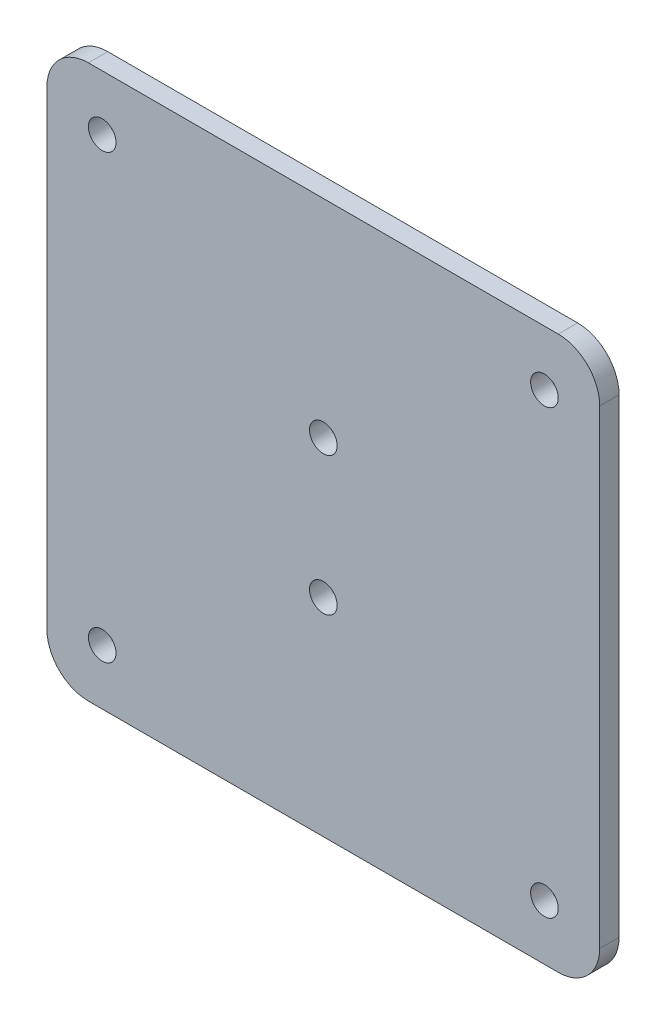
ISO-10303-21;
HEADER;
FILE_DESCRIPTION(('STEP AP214'),'2;1');
FILE_NAME('part.step','',(''),(''),'','','');
FILE_SCHEMA(('AUTOMOTIVE_DESIGN { 1 0 10303 214 1 1 1 1 }'));
ENDSEC;
DATA;
#1=APPLICATION_CONTEXT('core data for automotive mechanical design processes');
#2=APPLICATION_PROTOCOL_DEFINITION('international standard','automotive_design',2000,#1);
#3=PRODUCT_CONTEXT('',#1,'mechanical');
#4=PRODUCT('Part','Part','',(#3));
#5=PRODUCT_RELATED_PRODUCT_CATEGORY('part','',(#4));
#6=PRODUCT_DEFINITION_FORMATION('','',#4);
#7=PRODUCT_DEFINITION_CONTEXT('part definition',#1,'design');
#8=PRODUCT_DEFINITION('design','',#6,#7);
#9=PRODUCT_DEFINITION_SHAPE('','',#8);
#10=(LENGTH_UNIT() NAMED_UNIT(*) SI_UNIT(.MILLI.,.METRE.));
#11=(NAMED_UNIT(*) PLANE_ANGLE_UNIT() SI_UNIT($,.RADIAN.));
#12=(NAMED_UNIT(*) SI_UNIT($,.STERADIAN.) SOLID_ANGLE_UNIT());
#13=UNCERTAINTY_MEASURE_WITH_UNIT(LENGTH_MEASURE(1.E-05),#10,'distance_accuracy_value','');
#14=(GEOMETRIC_REPRESENTATION_CONTEXT(3) GLOBAL_UNCERTAINTY_ASSIGNED_CONTEXT((#13)) GLOBAL_UNIT_ASSIGNED_CONTEXT((#10,
#11,#12)) REPRESENTATION_CONTEXT('',''));
#15=CARTESIAN_POINT('',(0.,0.,0.));
#16=DIRECTION('',(0.,0.,1.));
#17=DIRECTION('',(1.,0.,0.));
#18=AXIS2_PLACEMENT_3D('',#15,#16,#17);
#19=CARTESIAN_POINT('',(0.,0.,7.));
#20=DIRECTION('',(0.,0.,-1.));
#21=DIRECTION('',(-1.,0.,0.));
#22=AXIS2_PLACEMENT_3D('',#19,#20,#21);
#23=PLANE('',#22);
#24=CARTESIAN_POINT('',(0.,-25.,7.));
#25=DIRECTION('',(0.,0.,-1.));
#26=DIRECTION('',(-1.,0.,0.));
#27=AXIS2_PLACEMENT_3D('',#24,#25,#26);
#28=CIRCLE('',#27,5.);
#29=CARTESIAN_POINT('',(-5.,-25.,7.));
#30=VERTEX_POINT('',#29);
#31=EDGE_CURVE('E235',#30,#30,#28,.T.);
#32=ORIENTED_EDGE('',*,*,#31,.T.);
#33=EDGE_LOOP('',(#32));
#34=FACE_BOUND('',#33,.T.);
#35=CARTESIAN_POINT('',(0.,25.,7.));
#36=DIRECTION('',(0.,0.,-1.));
#37=DIRECTION('',(-1.,0.,0.));
#38=AXIS2_PLACEMENT_3D('',#35,#36,#37);
#39=CIRCLE('',#38,5.);
#40=CARTESIAN_POINT('',(-5.,25.,7.));
#41=VERTEX_POINT('',#40);
#42=EDGE_CURVE('E242',#41,#41,#39,.T.);
#43=ORIENTED_EDGE('',*,*,#42,.T.);
#44=EDGE_LOOP('',(#43));
#45=FACE_BOUND('',#44,.T.);
#46=DIRECTION('',(0.,-1.,0.));
#47=VECTOR('',#46,1.);
#48=CARTESIAN_POINT('',(-100.,-100.,7.));
#49=LINE('',#48,#47);
#50=CARTESIAN_POINT('',(-100.,85.,7.));
#51=VERTEX_POINT('',#50);
#52=CARTESIAN_POINT('',(-100.,-85.,7.));
#53=VERTEX_POINT('',#52);
#54=EDGE_CURVE('E150',#51,#53,#49,.T.);
#55=ORIENTED_EDGE('',*,*,#54,.T.);
#56=CARTESIAN_POINT('',(-85.,-85.,7.));
#57=DIRECTION('',(0.,0.,-1.));
#58=DIRECTION('',(-1.,0.,0.));
#59=AXIS2_PLACEMENT_3D('',#56,#57,#58);
#60=CIRCLE('',#59,15.);
#61=CARTESIAN_POINT('',(-85.,-100.,7.));
#62=VERTEX_POINT('',#61);
#63=EDGE_CURVE('E174',#53,#62,#60,.F.);
#64=ORIENTED_EDGE('',*,*,#63,.T.);
#65=DIRECTION('',(1.,0.,0.));
#66=VECTOR('',#65,1.);
#67=CARTESIAN_POINT('',(-100.,-100.,7.));
#68=LINE('',#67,#66);
#69=CARTESIAN_POINT('',(85.,-100.,7.));
#70=VERTEX_POINT('',#69);
#71=EDGE_CURVE('E127',#62,#70,#68,.T.);
#72=ORIENTED_EDGE('',*,*,#71,.T.);
#73=CARTESIAN_POINT('',(85.,-85.,7.));
#74=DIRECTION('',(0.,0.,-1.));
#75=DIRECTION('',(-1.,0.,0.));
#76=AXIS2_PLACEMENT_3D('',#73,#74,#75);
#77=CIRCLE('',#76,15.);
#78=CARTESIAN_POINT('',(100.,-85.,7.));
#79=VERTEX_POINT('',#78);
#80=EDGE_CURVE('E166',#70,#79,#77,.F.);
#81=ORIENTED_EDGE('',*,*,#80,.T.);
#82=DIRECTION('',(0.,1.,0.));
#83=VECTOR('',#82,1.);
#84=CARTESIAN_POINT('',(100.,-100.,7.));
#85=LINE('',#84,#83);
#86=CARTESIAN_POINT('',(100.,85.,7.));
#87=VERTEX_POINT('',#86);
#88=EDGE_CURVE('E189',#79,#87,#85,.T.);
#89=ORIENTED_EDGE('',*,*,#88,.T.);
#90=CARTESIAN_POINT('',(85.,85.,7.));
#91=DIRECTION('',(0.,0.,-1.));
#92=DIRECTION('',(-1.,0.,0.));
#93=AXIS2_PLACEMENT_3D('',#90,#91,#92);
#94=CIRCLE('',#93,15.);
#95=CARTESIAN_POINT('',(85.,100.,7.));
#96=VERTEX_POINT('',#95);
#97=EDGE_CURVE('E62',#87,#96,#94,.F.);
#98=ORIENTED_EDGE('',*,*,#97,.T.);
#99=DIRECTION('',(-1.,0.,0.));
#100=VECTOR('',#99,1.);
#101=CARTESIAN_POINT('',(-100.,100.,7.));
#102=LINE('',#101,#100);
#103=CARTESIAN_POINT('',(-85.,100.,7.));
#104=VERTEX_POINT('',#103);
#105=EDGE_CURVE('E152',#96,#104,#102,.T.);
#106=ORIENTED_EDGE('',*,*,#105,.T.);
#107=CARTESIAN_POINT('',(-85.,85.,7.));
#108=DIRECTION('',(0.,0.,-1.));
#109=DIRECTION('',(-1.,0.,0.));
#110=AXIS2_PLACEMENT_3D('',#107,#108,#109);
#111=CIRCLE('',#110,15.);
#112=EDGE_CURVE('E171',#104,#51,#111,.F.);
#113=ORIENTED_EDGE('',*,*,#112,.T.);
#114=EDGE_LOOP('',(#55,#64,#72,#81,#89,#98,#106,#113));
#115=FACE_BOUND('',#114,.T.);
#116=CARTESIAN_POINT('',(80.,80.,7.));
#117=DIRECTION('',(0.,0.,1.));
#118=DIRECTION('',(1.,0.,0.));
#119=AXIS2_PLACEMENT_3D('',#116,#117,#118);
#120=CIRCLE('',#119,5.00000000000001);
#121=CARTESIAN_POINT('',(85.,80.,7.));
#122=VERTEX_POINT('',#121);
#123=EDGE_CURVE('E144',#122,#122,#120,.T.);
#124=ORIENTED_EDGE('',*,*,#123,.F.);
#125=EDGE_LOOP('',(#124));
#126=FACE_BOUND('',#125,.T.);
#127=CARTESIAN_POINT('',(80.,-80.,7.));
#128=DIRECTION('',(0.,0.,1.));
#129=DIRECTION('',(1.,0.,0.));
#130=AXIS2_PLACEMENT_3D('',#127,#128,#129);
#131=CIRCLE('',#130,5.00000000000001);
#132=CARTESIAN_POINT('',(85.,-80.,7.));
#133=VERTEX_POINT('',#132);
#134=EDGE_CURVE('E211',#133,#133,#131,.T.);
#135=ORIENTED_EDGE('',*,*,#134,.F.);
#136=EDGE_LOOP('',(#135));
#137=FACE_BOUND('',#136,.T.);
#138=CARTESIAN_POINT('',(-80.,-80.,7.));
#139=DIRECTION('',(0.,0.,1.));
#140=DIRECTION('',(1.,0.,0.));
#141=AXIS2_PLACEMENT_3D('',#138,#139,#140);
#142=CIRCLE('',#141,5.00000000000001);
#143=CARTESIAN_POINT('',(-75.,-80.,7.));
#144=VERTEX_POINT('',#143);
#145=EDGE_CURVE('E219',#144,#144,#142,.T.);
#146=ORIENTED_EDGE('',*,*,#145,.F.);
#147=EDGE_LOOP('',(#146));
#148=FACE_BOUND('',#147,.T.);
#149=CARTESIAN_POINT('',(-80.,80.,7.));
#150=DIRECTION('',(0.,0.,1.));
#151=DIRECTION('',(1.,0.,0.));
#152=AXIS2_PLACEMENT_3D('',#149,#150,#151);
#153=CIRCLE('',#152,5.00000000000001);
#154=CARTESIAN_POINT('',(-75.,80.,7.));
#155=VERTEX_POINT('',#154);
#156=EDGE_CURVE('E227',#155,#155,#153,.T.);
#157=ORIENTED_EDGE('',*,*,#156,.F.);
#158=EDGE_LOOP('',(#157));
#159=FACE_BOUND('',#158,.T.);
#160=ADVANCED_FACE('F39',(#34,#45,#115,#126,#137,#148,#159),#23,.F.);
#161=CARTESIAN_POINT('',(0.,0.,0.));
#162=DIRECTION('',(0.,0.,-1.));
#163=DIRECTION('',(-1.,0.,0.));
#164=AXIS2_PLACEMENT_3D('',#161,#162,#163);
#165=PLANE('',#164);
#166=CARTESIAN_POINT('',(0.,-25.,0.));
#167=DIRECTION('',(0.,0.,-1.));
#168=DIRECTION('',(-1.,0.,0.));
#169=AXIS2_PLACEMENT_3D('',#166,#167,#168);
#170=CIRCLE('',#169,5.);
#171=CARTESIAN_POINT('',(-5.,-25.,0.));
#172=VERTEX_POINT('',#171);
#173=EDGE_CURVE('E246',#172,#172,#170,.T.);
#174=ORIENTED_EDGE('',*,*,#173,.F.);
#175=EDGE_LOOP('',(#174));
#176=FACE_BOUND('',#175,.T.);
#177=CARTESIAN_POINT('',(0.,25.,0.));
#178=DIRECTION('',(0.,0.,-1.));
#179=DIRECTION('',(-1.,0.,0.));
#180=AXIS2_PLACEMENT_3D('',#177,#178,#179);
#181=CIRCLE('',#180,5.);
#182=CARTESIAN_POINT('',(-5.,25.,0.));
#183=VERTEX_POINT('',#182);
#184=EDGE_CURVE('E247',#183,#183,#181,.T.);
#185=ORIENTED_EDGE('',*,*,#184,.F.);
#186=EDGE_LOOP('',(#185));
#187=FACE_BOUND('',#186,.T.);
#188=CARTESIAN_POINT('',(-80.,-80.,0.));
#189=DIRECTION('',(0.,0.,1.));
#190=DIRECTION('',(1.,0.,0.));
#191=AXIS2_PLACEMENT_3D('',#188,#189,#190);
#192=CIRCLE('',#191,5.00000000000001);
#193=CARTESIAN_POINT('',(-75.,-80.,0.));
#194=VERTEX_POINT('',#193);
#195=EDGE_CURVE('E223',#194,#194,#192,.T.);
#196=ORIENTED_EDGE('',*,*,#195,.T.);
#197=EDGE_LOOP('',(#196));
#198=FACE_BOUND('',#197,.T.);
#199=CARTESIAN_POINT('',(80.,80.,0.));
#200=DIRECTION('',(0.,0.,1.));
#201=DIRECTION('',(1.,0.,0.));
#202=AXIS2_PLACEMENT_3D('',#199,#200,#201);
#203=CIRCLE('',#202,5.00000000000001);
#204=CARTESIAN_POINT('',(85.,80.,0.));
#205=VERTEX_POINT('',#204);
#206=EDGE_CURVE('E207',#205,#205,#203,.T.);
#207=ORIENTED_EDGE('',*,*,#206,.T.);
#208=EDGE_LOOP('',(#207));
#209=FACE_BOUND('',#208,.T.);
#210=DIRECTION('',(1.,0.,0.));
#211=VECTOR('',#210,1.);
#212=CARTESIAN_POINT('',(-100.,-100.,0.));
#213=LINE('',#212,#211);
#214=CARTESIAN_POINT('',(-85.,-100.,0.));
#215=VERTEX_POINT('',#214);
#216=CARTESIAN_POINT('',(85.,-100.,0.));
#217=VERTEX_POINT('',#216);
#218=EDGE_CURVE('E124',#215,#217,#213,.T.);
#219=ORIENTED_EDGE('',*,*,#218,.F.);
#220=CARTESIAN_POINT('',(-85.,-85.,0.));
#221=DIRECTION('',(0.,0.,-1.));
#222=DIRECTION('',(-1.,0.,0.));
#223=AXIS2_PLACEMENT_3D('',#220,#221,#222);
#224=CIRCLE('',#223,15.);
#225=CARTESIAN_POINT('',(-100.,-85.,0.));
#226=VERTEX_POINT('',#225);
#227=EDGE_CURVE('E106',#215,#226,#224,.T.);
#228=ORIENTED_EDGE('',*,*,#227,.T.);
#229=DIRECTION('',(0.,-1.,0.));
#230=VECTOR('',#229,1.);
#231=CARTESIAN_POINT('',(-100.,-100.,0.));
#232=LINE('',#231,#230);
#233=CARTESIAN_POINT('',(-100.,85.,0.));
#234=VERTEX_POINT('',#233);
#235=EDGE_CURVE('E137',#234,#226,#232,.T.);
#236=ORIENTED_EDGE('',*,*,#235,.F.);
#237=CARTESIAN_POINT('',(-85.,85.,0.));
#238=DIRECTION('',(0.,0.,-1.));
#239=DIRECTION('',(-1.,0.,0.));
#240=AXIS2_PLACEMENT_3D('',#237,#238,#239);
#241=CIRCLE('',#240,15.);
#242=CARTESIAN_POINT('',(-85.,100.,0.));
#243=VERTEX_POINT('',#242);
#244=EDGE_CURVE('E118',#234,#243,#241,.T.);
#245=ORIENTED_EDGE('',*,*,#244,.T.);
#246=DIRECTION('',(-1.,0.,0.));
#247=VECTOR('',#246,1.);
#248=CARTESIAN_POINT('',(-100.,100.,0.));
#249=LINE('',#248,#247);
#250=CARTESIAN_POINT('',(85.,100.,0.));
#251=VERTEX_POINT('',#250);
#252=EDGE_CURVE('E142',#251,#243,#249,.T.);
#253=ORIENTED_EDGE('',*,*,#252,.F.);
#254=CARTESIAN_POINT('',(85.,85.,0.));
#255=DIRECTION('',(0.,0.,-1.));
#256=DIRECTION('',(-1.,0.,0.));
#257=AXIS2_PLACEMENT_3D('',#254,#255,#256);
#258=CIRCLE('',#257,15.);
#259=CARTESIAN_POINT('',(100.,85.,0.));
#260=VERTEX_POINT('',#259);
#261=EDGE_CURVE('E156',#251,#260,#258,.T.);
#262=ORIENTED_EDGE('',*,*,#261,.T.);
#263=DIRECTION('',(0.,1.,0.));
#264=VECTOR('',#263,1.);
#265=CARTESIAN_POINT('',(100.,-100.,0.));
#266=LINE('',#265,#264);
#267=CARTESIAN_POINT('',(100.,-85.,0.));
#268=VERTEX_POINT('',#267);
#269=EDGE_CURVE('E136',#268,#260,#266,.T.);
#270=ORIENTED_EDGE('',*,*,#269,.F.);
#271=CARTESIAN_POINT('',(85.,-85.,0.));
#272=DIRECTION('',(0.,0.,-1.));
#273=DIRECTION('',(-1.,0.,0.));
#274=AXIS2_PLACEMENT_3D('',#271,#272,#273);
#275=CIRCLE('',#274,15.);
#276=EDGE_CURVE('E129',#268,#217,#275,.T.);
#277=ORIENTED_EDGE('',*,*,#276,.T.);
#278=EDGE_LOOP('',(#219,#228,#236,#245,#253,#262,#270,#277));
#279=FACE_BOUND('',#278,.T.);
#280=CARTESIAN_POINT('',(80.,-80.,0.));
#281=DIRECTION('',(0.,0.,1.));
#282=DIRECTION('',(1.,0.,0.));
#283=AXIS2_PLACEMENT_3D('',#280,#281,#282);
#284=CIRCLE('',#283,5.00000000000001);
#285=CARTESIAN_POINT('',(85.,-80.,0.));
#286=VERTEX_POINT('',#285);
#287=EDGE_CURVE('E215',#286,#286,#284,.T.);
#288=ORIENTED_EDGE('',*,*,#287,.T.);
#289=EDGE_LOOP('',(#288));
#290=FACE_BOUND('',#289,.T.);
#291=CARTESIAN_POINT('',(-80.,80.,0.));
#292=DIRECTION('',(0.,0.,1.));
#293=DIRECTION('',(1.,0.,0.));
#294=AXIS2_PLACEMENT_3D('',#291,#292,#293);
#295=CIRCLE('',#294,5.00000000000001);
#296=CARTESIAN_POINT('',(-75.,80.,0.));
#297=VERTEX_POINT('',#296);
#298=EDGE_CURVE('E231',#297,#297,#295,.T.);
#299=ORIENTED_EDGE('',*,*,#298,.T.);
#300=EDGE_LOOP('',(#299));
#301=FACE_BOUND('',#300,.T.);
#302=ADVANCED_FACE('F132',(#176,#187,#198,#209,#279,#290,#301),#165,.T.);
#303=CARTESIAN_POINT('',(-100.,-100.,7.));
#304=DIRECTION('',(1.,0.,0.));
#305=DIRECTION('',(0.,0.,-1.));
#306=AXIS2_PLACEMENT_3D('',#303,#304,#305);
#307=PLANE('',#306);
#308=ORIENTED_EDGE('',*,*,#235,.T.);
#309=DIRECTION('',(0.,0.,-1.));
#310=VECTOR('',#309,1.);
#311=CARTESIAN_POINT('',(-100.,-85.,7.));
#312=LINE('',#311,#310);
#313=EDGE_CURVE('E111',#226,#53,#312,.F.);
#314=ORIENTED_EDGE('',*,*,#313,.T.);
#315=ORIENTED_EDGE('',*,*,#54,.F.);
#316=DIRECTION('',(0.,0.,-1.));
#317=VECTOR('',#316,1.);
#318=CARTESIAN_POINT('',(-100.,85.,7.));
#319=LINE('',#318,#317);
#320=EDGE_CURVE('E117',#51,#234,#319,.T.);
#321=ORIENTED_EDGE('',*,*,#320,.T.);
#322=EDGE_LOOP('',(#308,#314,#315,#321));
#323=FACE_BOUND('',#322,.T.);
#324=ADVANCED_FACE('F260',(#323),#307,.F.);
#325=CARTESIAN_POINT('',(-100.,-100.,7.));
#326=DIRECTION('',(0.,1.,0.));
#327=DIRECTION('',(-1.,0.,0.));
#328=AXIS2_PLACEMENT_3D('',#325,#326,#327);
#329=PLANE('',#328);
#330=ORIENTED_EDGE('',*,*,#71,.F.);
#331=DIRECTION('',(0.,0.,-1.));
#332=VECTOR('',#331,1.);
#333=CARTESIAN_POINT('',(-85.,-100.,7.));
#334=LINE('',#333,#332);
#335=EDGE_CURVE('E110',#62,#215,#334,.T.);
#336=ORIENTED_EDGE('',*,*,#335,.T.);
#337=ORIENTED_EDGE('',*,*,#218,.T.);
#338=DIRECTION('',(0.,0.,-1.));
#339=VECTOR('',#338,1.);
#340=CARTESIAN_POINT('',(85.,-100.,7.));
#341=LINE('',#340,#339);
#342=EDGE_CURVE('E130',#217,#70,#341,.F.);
#343=ORIENTED_EDGE('',*,*,#342,.T.);
#344=EDGE_LOOP('',(#330,#336,#337,#343));
#345=FACE_BOUND('',#344,.T.);
#346=ADVANCED_FACE('F123',(#345),#329,.F.);
#347=CARTESIAN_POINT('',(100.,-100.,7.));
#348=DIRECTION('',(-1.,0.,0.));
#349=DIRECTION('',(0.,0.,1.));
#350=AXIS2_PLACEMENT_3D('',#347,#348,#349);
#351=PLANE('',#350);
#352=ORIENTED_EDGE('',*,*,#269,.T.);
#353=DIRECTION('',(0.,0.,-1.));
#354=VECTOR('',#353,1.);
#355=CARTESIAN_POINT('',(100.,85.,7.));
#356=LINE('',#355,#354);
#357=EDGE_CURVE('E11',#260,#87,#356,.F.);
#358=ORIENTED_EDGE('',*,*,#357,.T.);
#359=ORIENTED_EDGE('',*,*,#88,.F.);
#360=DIRECTION('',(0.,0.,-1.));
#361=VECTOR('',#360,1.);
#362=CARTESIAN_POINT('',(100.,-85.,7.));
#363=LINE('',#362,#361);
#364=EDGE_CURVE('E48',#79,#268,#363,.T.);
#365=ORIENTED_EDGE('',*,*,#364,.T.);
#366=EDGE_LOOP('',(#352,#358,#359,#365));
#367=FACE_BOUND('',#366,.T.);
#368=ADVANCED_FACE('F187',(#367),#351,.F.);
#369=CARTESIAN_POINT('',(-100.,100.,7.));
#370=DIRECTION('',(0.,-1.,0.));
#371=DIRECTION('',(0.,0.,-1.));
#372=AXIS2_PLACEMENT_3D('',#369,#370,#371);
#373=PLANE('',#372);
#374=ORIENTED_EDGE('',*,*,#252,.T.);
#375=DIRECTION('',(0.,0.,-1.));
#376=VECTOR('',#375,1.);
#377=CARTESIAN_POINT('',(-85.,100.,7.));
#378=LINE('',#377,#376);
#379=EDGE_CURVE('E55',#243,#104,#378,.F.);
#380=ORIENTED_EDGE('',*,*,#379,.T.);
#381=ORIENTED_EDGE('',*,*,#105,.F.);
#382=DIRECTION('',(0.,0.,-1.));
#383=VECTOR('',#382,1.);
#384=CARTESIAN_POINT('',(85.,100.,7.));
#385=LINE('',#384,#383);
#386=EDGE_CURVE('E177',#96,#251,#385,.T.);
#387=ORIENTED_EDGE('',*,*,#386,.T.);
#388=EDGE_LOOP('',(#374,#380,#381,#387));
#389=FACE_BOUND('',#388,.T.);
#390=ADVANCED_FACE('F196',(#389),#373,.F.);
#391=CARTESIAN_POINT('',(80.,80.,7.));
#392=DIRECTION('',(0.,0.,-1.));
#393=DIRECTION('',(-1.,0.,0.));
#394=AXIS2_PLACEMENT_3D('',#391,#392,#393);
#395=CYLINDRICAL_SURFACE('',#394,5.00000000000001);
#396=ORIENTED_EDGE('',*,*,#123,.T.);
#397=EDGE_LOOP('',(#396));
#398=FACE_BOUND('',#397,.T.);
#399=ORIENTED_EDGE('',*,*,#206,.F.);
#400=EDGE_LOOP('',(#399));
#401=FACE_BOUND('',#400,.T.);
#402=ADVANCED_FACE('F268',(#398,#401),#395,.F.);
#403=CARTESIAN_POINT('',(80.,-80.,7.));
#404=DIRECTION('',(0.,0.,-1.));
#405=DIRECTION('',(-1.,0.,0.));
#406=AXIS2_PLACEMENT_3D('',#403,#404,#405);
#407=CYLINDRICAL_SURFACE('',#406,5.00000000000001);
#408=ORIENTED_EDGE('',*,*,#134,.T.);
#409=EDGE_LOOP('',(#408));
#410=FACE_BOUND('',#409,.T.);
#411=ORIENTED_EDGE('',*,*,#287,.F.);
#412=EDGE_LOOP('',(#411));
#413=FACE_BOUND('',#412,.T.);
#414=ADVANCED_FACE('F270',(#410,#413),#407,.F.);
#415=CARTESIAN_POINT('',(-80.,-80.,7.));
#416=DIRECTION('',(0.,0.,-1.));
#417=DIRECTION('',(-1.,0.,0.));
#418=AXIS2_PLACEMENT_3D('',#415,#416,#417);
#419=CYLINDRICAL_SURFACE('',#418,5.00000000000001);
#420=ORIENTED_EDGE('',*,*,#145,.T.);
#421=EDGE_LOOP('',(#420));
#422=FACE_BOUND('',#421,.T.);
#423=ORIENTED_EDGE('',*,*,#195,.F.);
#424=EDGE_LOOP('',(#423));
#425=FACE_BOUND('',#424,.T.);
#426=ADVANCED_FACE('F277',(#422,#425),#419,.F.);
#427=CARTESIAN_POINT('',(-80.,80.,7.));
#428=DIRECTION('',(0.,0.,-1.));
#429=DIRECTION('',(-1.,0.,0.));
#430=AXIS2_PLACEMENT_3D('',#427,#428,#429);
#431=CYLINDRICAL_SURFACE('',#430,5.00000000000001);
#432=ORIENTED_EDGE('',*,*,#156,.T.);
#433=EDGE_LOOP('',(#432));
#434=FACE_BOUND('',#433,.T.);
#435=ORIENTED_EDGE('',*,*,#298,.F.);
#436=EDGE_LOOP('',(#435));
#437=FACE_BOUND('',#436,.T.);
#438=ADVANCED_FACE('F298',(#434,#437),#431,.F.);
#439=CARTESIAN_POINT('',(-85.,-85.,7.));
#440=DIRECTION('',(0.,0.,-1.));
#441=DIRECTION('',(-1.,0.,0.));
#442=AXIS2_PLACEMENT_3D('',#439,#440,#441);
#443=CYLINDRICAL_SURFACE('',#442,15.);
#444=ORIENTED_EDGE('',*,*,#63,.F.);
#445=ORIENTED_EDGE('',*,*,#313,.F.);
#446=ORIENTED_EDGE('',*,*,#227,.F.);
#447=ORIENTED_EDGE('',*,*,#335,.F.);
#448=EDGE_LOOP('',(#444,#445,#446,#447));
#449=FACE_BOUND('',#448,.T.);
#450=ADVANCED_FACE('F109',(#449),#443,.T.);
#451=CARTESIAN_POINT('',(-85.,85.,7.));
#452=DIRECTION('',(0.,0.,-1.));
#453=DIRECTION('',(-1.,0.,0.));
#454=AXIS2_PLACEMENT_3D('',#451,#452,#453);
#455=CYLINDRICAL_SURFACE('',#454,15.);
#456=ORIENTED_EDGE('',*,*,#112,.F.);
#457=ORIENTED_EDGE('',*,*,#379,.F.);
#458=ORIENTED_EDGE('',*,*,#244,.F.);
#459=ORIENTED_EDGE('',*,*,#320,.F.);
#460=EDGE_LOOP('',(#456,#457,#458,#459));
#461=FACE_BOUND('',#460,.T.);
#462=ADVANCED_FACE('F297',(#461),#455,.T.);
#463=CARTESIAN_POINT('',(85.,85.,7.));
#464=DIRECTION('',(0.,0.,-1.));
#465=DIRECTION('',(-1.,0.,0.));
#466=AXIS2_PLACEMENT_3D('',#463,#464,#465);
#467=CYLINDRICAL_SURFACE('',#466,15.);
#468=ORIENTED_EDGE('',*,*,#97,.F.);
#469=ORIENTED_EDGE('',*,*,#357,.F.);
#470=ORIENTED_EDGE('',*,*,#261,.F.);
#471=ORIENTED_EDGE('',*,*,#386,.F.);
#472=EDGE_LOOP('',(#468,#469,#470,#471));
#473=FACE_BOUND('',#472,.T.);
#474=ADVANCED_FACE('F195',(#473),#467,.T.);
#475=CARTESIAN_POINT('',(85.,-85.,7.));
#476=DIRECTION('',(0.,0.,-1.));
#477=DIRECTION('',(-1.,0.,0.));
#478=AXIS2_PLACEMENT_3D('',#475,#476,#477);
#479=CYLINDRICAL_SURFACE('',#478,15.);
#480=ORIENTED_EDGE('',*,*,#80,.F.);
#481=ORIENTED_EDGE('',*,*,#342,.F.);
#482=ORIENTED_EDGE('',*,*,#276,.F.);
#483=ORIENTED_EDGE('',*,*,#364,.F.);
#484=EDGE_LOOP('',(#480,#481,#482,#483));
#485=FACE_BOUND('',#484,.T.);
#486=ADVANCED_FACE('F41',(#485),#479,.T.);
#487=CARTESIAN_POINT('',(0.,25.,10.));
#488=DIRECTION('',(0.,0.,-1.));
#489=DIRECTION('',(-1.,0.,0.));
#490=AXIS2_PLACEMENT_3D('',#487,#488,#489);
#491=CYLINDRICAL_SURFACE('',#490,5.);
#492=ORIENTED_EDGE('',*,*,#184,.T.);
#493=EDGE_LOOP('',(#492));
#494=FACE_BOUND('',#493,.T.);
#495=ORIENTED_EDGE('',*,*,#42,.F.);
#496=EDGE_LOOP('',(#495));
#497=FACE_BOUND('',#496,.T.);
#498=ADVANCED_FACE('F305',(#494,#497),#491,.F.);
#499=CARTESIAN_POINT('',(0.,-25.,10.));
#500=DIRECTION('',(0.,0.,-1.));
#501=DIRECTION('',(-1.,0.,0.));
#502=AXIS2_PLACEMENT_3D('',#499,#500,#501);
#503=CYLINDRICAL_SURFACE('',#502,5.);
#504=ORIENTED_EDGE('',*,*,#173,.T.);
#505=EDGE_LOOP('',(#504));
#506=FACE_BOUND('',#505,.T.);
#507=ORIENTED_EDGE('',*,*,#31,.F.);
#508=EDGE_LOOP('',(#507));
#509=FACE_BOUND('',#508,.T.);
#510=ADVANCED_FACE('F255',(#506,#509),#503,.F.);
#511=CLOSED_SHELL('',(#160,#302,#324,#346,#368,#390,#402,#414,#426,#438,#450,#462,#474,#486,
#498,#510));
#512=MANIFOLD_SOLID_BREP('B2',#511);
#513=ADVANCED_BREP_SHAPE_REPRESENTATION('',(#18,#512),#14);
#514=SHAPE_DEFINITION_REPRESENTATION(#9,#513);
ENDSEC;
END-ISO-10303-21;
